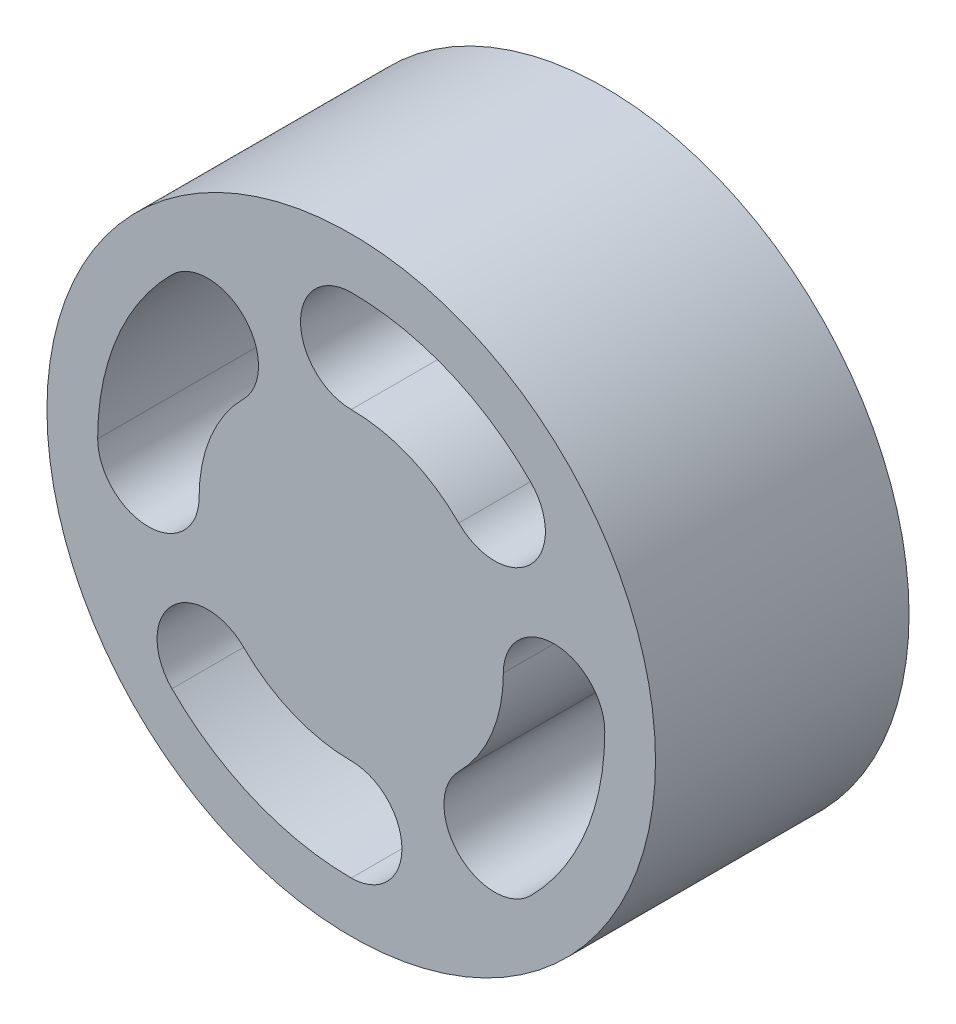
ISO-10303-21;
HEADER;
FILE_DESCRIPTION(('STEP AP214'),'2;1');
FILE_NAME('part.step','',(''),(''),'','','');
FILE_SCHEMA(('AUTOMOTIVE_DESIGN { 1 0 10303 214 1 1 1 1 }'));
ENDSEC;
DATA;
#1=APPLICATION_CONTEXT('core data for automotive mechanical design processes');
#2=APPLICATION_PROTOCOL_DEFINITION('international standard','automotive_design',2000,#1);
#3=PRODUCT_CONTEXT('',#1,'mechanical');
#4=PRODUCT('Part','Part','',(#3));
#5=PRODUCT_RELATED_PRODUCT_CATEGORY('part','',(#4));
#6=PRODUCT_DEFINITION_FORMATION('','',#4);
#7=PRODUCT_DEFINITION_CONTEXT('part definition',#1,'design');
#8=PRODUCT_DEFINITION('design','',#6,#7);
#9=PRODUCT_DEFINITION_SHAPE('','',#8);
#10=(LENGTH_UNIT() NAMED_UNIT(*) SI_UNIT(.MILLI.,.METRE.));
#11=(NAMED_UNIT(*) PLANE_ANGLE_UNIT() SI_UNIT($,.RADIAN.));
#12=(NAMED_UNIT(*) SI_UNIT($,.STERADIAN.) SOLID_ANGLE_UNIT());
#13=UNCERTAINTY_MEASURE_WITH_UNIT(LENGTH_MEASURE(1.E-05),#10,'distance_accuracy_value','');
#14=(GEOMETRIC_REPRESENTATION_CONTEXT(3) GLOBAL_UNCERTAINTY_ASSIGNED_CONTEXT((#13)) GLOBAL_UNIT_ASSIGNED_CONTEXT((#10,
#11,#12)) REPRESENTATION_CONTEXT('',''));
#15=CARTESIAN_POINT('',(0.,0.,0.));
#16=DIRECTION('',(0.,0.,1.));
#17=DIRECTION('',(1.,0.,0.));
#18=AXIS2_PLACEMENT_3D('',#15,#16,#17);
#19=CARTESIAN_POINT('',(0.,0.,0.));
#20=DIRECTION('',(0.,0.,1.));
#21=DIRECTION('',(1.,0.,0.));
#22=AXIS2_PLACEMENT_3D('',#19,#20,#21);
#23=PLANE('',#22);
#24=CARTESIAN_POINT('',(-14.1421356237309,-14.142135623731,0.));
#25=DIRECTION('',(0.,0.,-1.));
#26=DIRECTION('',(-1.,0.,0.));
#27=AXIS2_PLACEMENT_3D('',#24,#25,#26);
#28=CIRCLE('',#27,5.);
#29=CARTESIAN_POINT('',(-17.6776695296636,-17.6776695296638,0.));
#30=VERTEX_POINT('',#29);
#31=CARTESIAN_POINT('',(-10.6066017177982,-10.6066017177983,0.));
#32=VERTEX_POINT('',#31);
#33=EDGE_CURVE('E241',#30,#32,#28,.T.);
#34=ORIENTED_EDGE('',*,*,#33,.F.);
#35=CARTESIAN_POINT('',(0.,0.,0.));
#36=DIRECTION('',(0.,0.,-1.));
#37=DIRECTION('',(-1.,0.,0.));
#38=AXIS2_PLACEMENT_3D('',#35,#36,#37);
#39=CIRCLE('',#38,25.);
#40=CARTESIAN_POINT('',(1.75875109549139E-13,-25.,0.));
#41=VERTEX_POINT('',#40);
#42=EDGE_CURVE('E61',#41,#30,#39,.T.);
#43=ORIENTED_EDGE('',*,*,#42,.F.);
#44=CARTESIAN_POINT('',(1.40526615291714E-13,-20.,0.));
#45=DIRECTION('',(0.,0.,-1.));
#46=DIRECTION('',(-1.,0.,0.));
#47=AXIS2_PLACEMENT_3D('',#44,#45,#46);
#48=CIRCLE('',#47,5.);
#49=CARTESIAN_POINT('',(1.05178121034288E-13,-15.,0.));
#50=VERTEX_POINT('',#49);
#51=EDGE_CURVE('E249',#50,#41,#48,.T.);
#52=ORIENTED_EDGE('',*,*,#51,.F.);
#53=CARTESIAN_POINT('',(0.,0.,0.));
#54=DIRECTION('',(0.,0.,-1.));
#55=DIRECTION('',(-1.,0.,0.));
#56=AXIS2_PLACEMENT_3D('',#53,#54,#55);
#57=CIRCLE('',#56,15.);
#58=EDGE_CURVE('E245',#50,#32,#57,.T.);
#59=ORIENTED_EDGE('',*,*,#58,.T.);
#60=EDGE_LOOP('',(#34,#43,#52,#59));
#61=FACE_BOUND('',#60,.T.);
#62=CARTESIAN_POINT('',(0.,0.,0.));
#63=DIRECTION('',(0.,0.,-1.));
#64=DIRECTION('',(-1.,0.,0.));
#65=AXIS2_PLACEMENT_3D('',#62,#63,#64);
#66=CIRCLE('',#65,15.);
#67=CARTESIAN_POINT('',(-15.,0.,0.));
#68=VERTEX_POINT('',#67);
#69=CARTESIAN_POINT('',(-10.6066017177982,10.6066017177982,0.));
#70=VERTEX_POINT('',#69);
#71=EDGE_CURVE('E283',#68,#70,#66,.T.);
#72=ORIENTED_EDGE('',*,*,#71,.T.);
#73=CARTESIAN_POINT('',(-14.142135623731,14.1421356237309,0.));
#74=DIRECTION('',(0.,0.,-1.));
#75=DIRECTION('',(-1.,0.,0.));
#76=AXIS2_PLACEMENT_3D('',#73,#74,#75);
#77=CIRCLE('',#76,5.);
#78=CARTESIAN_POINT('',(-17.6776695296637,17.6776695296637,0.));
#79=VERTEX_POINT('',#78);
#80=EDGE_CURVE('E69',#79,#70,#77,.T.);
#81=ORIENTED_EDGE('',*,*,#80,.F.);
#82=CARTESIAN_POINT('',(0.,0.,0.));
#83=DIRECTION('',(0.,0.,-1.));
#84=DIRECTION('',(-1.,0.,0.));
#85=AXIS2_PLACEMENT_3D('',#82,#83,#84);
#86=CIRCLE('',#85,25.);
#87=CARTESIAN_POINT('',(-25.,0.,0.));
#88=VERTEX_POINT('',#87);
#89=EDGE_CURVE('E291',#88,#79,#86,.T.);
#90=ORIENTED_EDGE('',*,*,#89,.F.);
#91=CARTESIAN_POINT('',(-20.,0.,0.));
#92=DIRECTION('',(0.,0.,-1.));
#93=DIRECTION('',(-1.,0.,0.));
#94=AXIS2_PLACEMENT_3D('',#91,#92,#93);
#95=CIRCLE('',#94,5.);
#96=EDGE_CURVE('E287',#68,#88,#95,.T.);
#97=ORIENTED_EDGE('',*,*,#96,.F.);
#98=EDGE_LOOP('',(#72,#81,#90,#97));
#99=FACE_BOUND('',#98,.T.);
#100=CARTESIAN_POINT('',(14.1421356237308,14.1421356237311,0.));
#101=DIRECTION('',(0.,0.,-1.));
#102=DIRECTION('',(-1.,0.,0.));
#103=AXIS2_PLACEMENT_3D('',#100,#101,#102);
#104=CIRCLE('',#103,5.);
#105=CARTESIAN_POINT('',(17.6776695296635,17.6776695296639,0.));
#106=VERTEX_POINT('',#105);
#107=CARTESIAN_POINT('',(10.6066017177981,10.6066017177983,0.));
#108=VERTEX_POINT('',#107);
#109=EDGE_CURVE('E204',#106,#108,#104,.T.);
#110=ORIENTED_EDGE('',*,*,#109,.F.);
#111=CARTESIAN_POINT('',(0.,0.,0.));
#112=DIRECTION('',(0.,0.,-1.));
#113=DIRECTION('',(-1.,0.,0.));
#114=AXIS2_PLACEMENT_3D('',#111,#112,#113);
#115=CIRCLE('',#114,25.);
#116=CARTESIAN_POINT('',(0.,25.,0.));
#117=VERTEX_POINT('',#116);
#118=EDGE_CURVE('E192',#117,#106,#115,.T.);
#119=ORIENTED_EDGE('',*,*,#118,.F.);
#120=CARTESIAN_POINT('',(0.,20.,0.));
#121=DIRECTION('',(0.,0.,-1.));
#122=DIRECTION('',(-1.,0.,0.));
#123=AXIS2_PLACEMENT_3D('',#120,#121,#122);
#124=CIRCLE('',#123,5.);
#125=CARTESIAN_POINT('',(0.,15.,0.));
#126=VERTEX_POINT('',#125);
#127=EDGE_CURVE('E194',#126,#117,#124,.T.);
#128=ORIENTED_EDGE('',*,*,#127,.F.);
#129=CARTESIAN_POINT('',(0.,0.,0.));
#130=DIRECTION('',(0.,0.,-1.));
#131=DIRECTION('',(-1.,0.,0.));
#132=AXIS2_PLACEMENT_3D('',#129,#130,#131);
#133=CIRCLE('',#132,15.);
#134=EDGE_CURVE('E212',#126,#108,#133,.T.);
#135=ORIENTED_EDGE('',*,*,#134,.T.);
#136=EDGE_LOOP('',(#110,#119,#128,#135));
#137=FACE_BOUND('',#136,.T.);
#138=CARTESIAN_POINT('',(0.,0.,0.));
#139=DIRECTION('',(0.,0.,-1.));
#140=DIRECTION('',(-1.,0.,0.));
#141=AXIS2_PLACEMENT_3D('',#138,#139,#140);
#142=CIRCLE('',#141,15.);
#143=CARTESIAN_POINT('',(15.,1.60260846548149E-13,0.));
#144=VERTEX_POINT('',#143);
#145=CARTESIAN_POINT('',(10.6066017177983,-10.6066017177981,0.));
#146=VERTEX_POINT('',#145);
#147=EDGE_CURVE('E324',#144,#146,#142,.T.);
#148=ORIENTED_EDGE('',*,*,#147,.T.);
#149=CARTESIAN_POINT('',(14.1421356237311,-14.1421356237308,0.));
#150=DIRECTION('',(0.,0.,-1.));
#151=DIRECTION('',(-1.,0.,0.));
#152=AXIS2_PLACEMENT_3D('',#149,#150,#151);
#153=CIRCLE('',#152,5.);
#154=CARTESIAN_POINT('',(17.6776695296638,-17.6776695296635,0.));
#155=VERTEX_POINT('',#154);
#156=EDGE_CURVE('E321',#155,#146,#153,.T.);
#157=ORIENTED_EDGE('',*,*,#156,.F.);
#158=CARTESIAN_POINT('',(0.,0.,0.));
#159=DIRECTION('',(0.,0.,-1.));
#160=DIRECTION('',(-1.,0.,0.));
#161=AXIS2_PLACEMENT_3D('',#158,#159,#160);
#162=CIRCLE('',#161,25.);
#163=CARTESIAN_POINT('',(25.,2.67390531492911E-13,0.));
#164=VERTEX_POINT('',#163);
#165=EDGE_CURVE('E332',#164,#155,#162,.T.);
#166=ORIENTED_EDGE('',*,*,#165,.F.);
#167=CARTESIAN_POINT('',(20.,2.1382568902053E-13,0.));
#168=DIRECTION('',(0.,0.,-1.));
#169=DIRECTION('',(-1.,0.,0.));
#170=AXIS2_PLACEMENT_3D('',#167,#168,#169);
#171=CIRCLE('',#170,5.);
#172=EDGE_CURVE('E328',#144,#164,#171,.T.);
#173=ORIENTED_EDGE('',*,*,#172,.F.);
#174=EDGE_LOOP('',(#148,#157,#166,#173));
#175=FACE_BOUND('',#174,.T.);
#176=CARTESIAN_POINT('',(0.,0.,0.));
#177=DIRECTION('',(0.,0.,1.));
#178=DIRECTION('',(1.,0.,0.));
#179=AXIS2_PLACEMENT_3D('',#176,#177,#178);
#180=CIRCLE('',#179,3.);
#181=CARTESIAN_POINT('',(3.,0.,0.));
#182=VERTEX_POINT('',#181);
#183=EDGE_CURVE('E366',#182,#182,#180,.T.);
#184=ORIENTED_EDGE('',*,*,#183,.T.);
#185=EDGE_LOOP('',(#184));
#186=FACE_BOUND('',#185,.T.);
#187=CARTESIAN_POINT('',(0.,0.,0.));
#188=DIRECTION('',(0.,0.,1.));
#189=DIRECTION('',(1.,0.,0.));
#190=AXIS2_PLACEMENT_3D('',#187,#188,#189);
#191=CIRCLE('',#190,30.);
#192=CARTESIAN_POINT('',(30.,0.,0.));
#193=VERTEX_POINT('',#192);
#194=EDGE_CURVE('E49',#193,#193,#191,.T.);
#195=ORIENTED_EDGE('',*,*,#194,.F.);
#196=EDGE_LOOP('',(#195));
#197=FACE_BOUND('',#196,.T.);
#198=ADVANCED_FACE('F45',(#61,#99,#137,#175,#186,#197),#23,.F.);
#199=CARTESIAN_POINT('',(0.,0.,25.));
#200=DIRECTION('',(0.,0.,-1.));
#201=DIRECTION('',(-1.,0.,0.));
#202=AXIS2_PLACEMENT_3D('',#199,#200,#201);
#203=CYLINDRICAL_SURFACE('',#202,30.);
#204=CARTESIAN_POINT('',(0.,0.,25.));
#205=DIRECTION('',(0.,0.,1.));
#206=DIRECTION('',(1.,0.,0.));
#207=AXIS2_PLACEMENT_3D('',#204,#205,#206);
#208=CIRCLE('',#207,30.);
#209=CARTESIAN_POINT('',(30.,0.,25.));
#210=VERTEX_POINT('',#209);
#211=EDGE_CURVE('E11',#210,#210,#208,.T.);
#212=ORIENTED_EDGE('',*,*,#211,.F.);
#213=EDGE_LOOP('',(#212));
#214=FACE_BOUND('',#213,.T.);
#215=ORIENTED_EDGE('',*,*,#194,.T.);
#216=EDGE_LOOP('',(#215));
#217=FACE_BOUND('',#216,.T.);
#218=ADVANCED_FACE('F47',(#214,#217),#203,.T.);
#219=CARTESIAN_POINT('',(0.,0.,25.));
#220=DIRECTION('',(0.,0.,1.));
#221=DIRECTION('',(1.,0.,0.));
#222=AXIS2_PLACEMENT_3D('',#219,#220,#221);
#223=PLANE('',#222);
#224=CARTESIAN_POINT('',(0.,0.,25.));
#225=DIRECTION('',(0.,0.,1.));
#226=DIRECTION('',(1.,0.,0.));
#227=AXIS2_PLACEMENT_3D('',#224,#225,#226);
#228=CIRCLE('',#227,25.);
#229=CARTESIAN_POINT('',(1.75875109549139E-13,-25.,25.));
#230=VERTEX_POINT('',#229);
#231=CARTESIAN_POINT('',(-17.6776695296636,-17.6776695296638,25.));
#232=VERTEX_POINT('',#231);
#233=EDGE_CURVE('E235',#230,#232,#228,.F.);
#234=ORIENTED_EDGE('',*,*,#233,.T.);
#235=CARTESIAN_POINT('',(-14.1421356237309,-14.142135623731,25.));
#236=DIRECTION('',(0.,0.,1.));
#237=DIRECTION('',(1.,0.,0.));
#238=AXIS2_PLACEMENT_3D('',#235,#236,#237);
#239=CIRCLE('',#238,5.);
#240=CARTESIAN_POINT('',(-10.6066017177982,-10.6066017177983,25.));
#241=VERTEX_POINT('',#240);
#242=EDGE_CURVE('E257',#232,#241,#239,.F.);
#243=ORIENTED_EDGE('',*,*,#242,.T.);
#244=CARTESIAN_POINT('',(0.,0.,25.));
#245=DIRECTION('',(0.,0.,1.));
#246=DIRECTION('',(1.,0.,0.));
#247=AXIS2_PLACEMENT_3D('',#244,#245,#246);
#248=CIRCLE('',#247,15.);
#249=CARTESIAN_POINT('',(1.05178121034288E-13,-15.,25.));
#250=VERTEX_POINT('',#249);
#251=EDGE_CURVE('E226',#250,#241,#248,.F.);
#252=ORIENTED_EDGE('',*,*,#251,.F.);
#253=CARTESIAN_POINT('',(1.40526615291714E-13,-20.,25.));
#254=DIRECTION('',(0.,0.,1.));
#255=DIRECTION('',(1.,0.,0.));
#256=AXIS2_PLACEMENT_3D('',#253,#254,#255);
#257=CIRCLE('',#256,5.);
#258=EDGE_CURVE('E230',#250,#230,#257,.F.);
#259=ORIENTED_EDGE('',*,*,#258,.T.);
#260=EDGE_LOOP('',(#234,#243,#252,#259));
#261=FACE_BOUND('',#260,.T.);
#262=CARTESIAN_POINT('',(-14.142135623731,14.1421356237309,25.));
#263=DIRECTION('',(0.,0.,1.));
#264=DIRECTION('',(1.,0.,0.));
#265=AXIS2_PLACEMENT_3D('',#262,#263,#264);
#266=CIRCLE('',#265,5.);
#267=CARTESIAN_POINT('',(-17.6776695296637,17.6776695296637,25.));
#268=VERTEX_POINT('',#267);
#269=CARTESIAN_POINT('',(-10.6066017177982,10.6066017177982,25.));
#270=VERTEX_POINT('',#269);
#271=EDGE_CURVE('E277',#268,#270,#266,.F.);
#272=ORIENTED_EDGE('',*,*,#271,.T.);
#273=CARTESIAN_POINT('',(0.,0.,25.));
#274=DIRECTION('',(0.,0.,1.));
#275=DIRECTION('',(1.,0.,0.));
#276=AXIS2_PLACEMENT_3D('',#273,#274,#275);
#277=CIRCLE('',#276,15.);
#278=CARTESIAN_POINT('',(-15.,0.,25.));
#279=VERTEX_POINT('',#278);
#280=EDGE_CURVE('E231',#279,#270,#277,.F.);
#281=ORIENTED_EDGE('',*,*,#280,.F.);
#282=CARTESIAN_POINT('',(-20.,0.,25.));
#283=DIRECTION('',(0.,0.,1.));
#284=DIRECTION('',(1.,0.,0.));
#285=AXIS2_PLACEMENT_3D('',#282,#283,#284);
#286=CIRCLE('',#285,5.);
#287=CARTESIAN_POINT('',(-25.,0.,25.));
#288=VERTEX_POINT('',#287);
#289=EDGE_CURVE('E184',#279,#288,#286,.F.);
#290=ORIENTED_EDGE('',*,*,#289,.T.);
#291=CARTESIAN_POINT('',(0.,0.,25.));
#292=DIRECTION('',(0.,0.,1.));
#293=DIRECTION('',(1.,0.,0.));
#294=AXIS2_PLACEMENT_3D('',#291,#292,#293);
#295=CIRCLE('',#294,25.);
#296=EDGE_CURVE('E273',#288,#268,#295,.F.);
#297=ORIENTED_EDGE('',*,*,#296,.T.);
#298=EDGE_LOOP('',(#272,#281,#290,#297));
#299=FACE_BOUND('',#298,.T.);
#300=CARTESIAN_POINT('',(0.,0.,25.));
#301=DIRECTION('',(0.,0.,1.));
#302=DIRECTION('',(1.,0.,0.));
#303=AXIS2_PLACEMENT_3D('',#300,#301,#302);
#304=CIRCLE('',#303,25.);
#305=CARTESIAN_POINT('',(0.,25.,25.));
#306=VERTEX_POINT('',#305);
#307=CARTESIAN_POINT('',(17.6776695296635,17.6776695296639,25.));
#308=VERTEX_POINT('',#307);
#309=EDGE_CURVE('E189',#306,#308,#304,.F.);
#310=ORIENTED_EDGE('',*,*,#309,.T.);
#311=CARTESIAN_POINT('',(14.1421356237308,14.1421356237311,25.));
#312=DIRECTION('',(0.,0.,1.));
#313=DIRECTION('',(1.,0.,0.));
#314=AXIS2_PLACEMENT_3D('',#311,#312,#313);
#315=CIRCLE('',#314,5.);
#316=CARTESIAN_POINT('',(10.6066017177981,10.6066017177983,25.));
#317=VERTEX_POINT('',#316);
#318=EDGE_CURVE('E172',#308,#317,#315,.F.);
#319=ORIENTED_EDGE('',*,*,#318,.T.);
#320=CARTESIAN_POINT('',(0.,0.,25.));
#321=DIRECTION('',(0.,0.,1.));
#322=DIRECTION('',(1.,0.,0.));
#323=AXIS2_PLACEMENT_3D('',#320,#321,#322);
#324=CIRCLE('',#323,15.);
#325=CARTESIAN_POINT('',(0.,15.,25.));
#326=VERTEX_POINT('',#325);
#327=EDGE_CURVE('E206',#326,#317,#324,.F.);
#328=ORIENTED_EDGE('',*,*,#327,.F.);
#329=CARTESIAN_POINT('',(0.,20.,25.));
#330=DIRECTION('',(0.,0.,1.));
#331=DIRECTION('',(1.,0.,0.));
#332=AXIS2_PLACEMENT_3D('',#329,#330,#331);
#333=CIRCLE('',#332,5.);
#334=EDGE_CURVE('E199',#326,#306,#333,.F.);
#335=ORIENTED_EDGE('',*,*,#334,.T.);
#336=EDGE_LOOP('',(#310,#319,#328,#335));
#337=FACE_BOUND('',#336,.T.);
#338=CARTESIAN_POINT('',(14.1421356237311,-14.1421356237308,25.));
#339=DIRECTION('',(0.,0.,1.));
#340=DIRECTION('',(1.,0.,0.));
#341=AXIS2_PLACEMENT_3D('',#338,#339,#340);
#342=CIRCLE('',#341,5.);
#343=CARTESIAN_POINT('',(17.6776695296638,-17.6776695296635,25.));
#344=VERTEX_POINT('',#343);
#345=CARTESIAN_POINT('',(10.6066017177983,-10.6066017177981,25.));
#346=VERTEX_POINT('',#345);
#347=EDGE_CURVE('E317',#344,#346,#342,.F.);
#348=ORIENTED_EDGE('',*,*,#347,.T.);
#349=CARTESIAN_POINT('',(0.,0.,25.));
#350=DIRECTION('',(0.,0.,1.));
#351=DIRECTION('',(1.,0.,0.));
#352=AXIS2_PLACEMENT_3D('',#349,#350,#351);
#353=CIRCLE('',#352,15.);
#354=CARTESIAN_POINT('',(15.,0.,25.));
#355=VERTEX_POINT('',#354);
#356=EDGE_CURVE('E340',#355,#346,#353,.F.);
#357=ORIENTED_EDGE('',*,*,#356,.F.);
#358=CARTESIAN_POINT('',(20.,2.1382568902053E-13,25.));
#359=DIRECTION('',(0.,0.,1.));
#360=DIRECTION('',(1.,0.,0.));
#361=AXIS2_PLACEMENT_3D('',#358,#359,#360);
#362=CIRCLE('',#361,5.);
#363=CARTESIAN_POINT('',(25.,2.67390531492911E-13,25.));
#364=VERTEX_POINT('',#363);
#365=EDGE_CURVE('E269',#355,#364,#362,.F.);
#366=ORIENTED_EDGE('',*,*,#365,.T.);
#367=CARTESIAN_POINT('',(0.,0.,25.));
#368=DIRECTION('',(0.,0.,1.));
#369=DIRECTION('',(1.,0.,0.));
#370=AXIS2_PLACEMENT_3D('',#367,#368,#369);
#371=CIRCLE('',#370,25.);
#372=EDGE_CURVE('E313',#364,#344,#371,.F.);
#373=ORIENTED_EDGE('',*,*,#372,.T.);
#374=EDGE_LOOP('',(#348,#357,#366,#373));
#375=FACE_BOUND('',#374,.T.);
#376=ORIENTED_EDGE('',*,*,#211,.T.);
#377=EDGE_LOOP('',(#376));
#378=FACE_BOUND('',#377,.T.);
#379=ADVANCED_FACE('F197',(#261,#299,#337,#375,#378),#223,.T.);
#380=CARTESIAN_POINT('',(0.,1.4,-10.));
#381=DIRECTION('',(0.,-1.,0.));
#382=DIRECTION('',(0.,0.,-1.));
#383=AXIS2_PLACEMENT_3D('',#380,#381,#382);
#384=PLANE('',#383);
#385=CARTESIAN_POINT('',(0.,1.4,-7.));
#386=DIRECTION('',(0.,-1.,0.));
#387=DIRECTION('',(0.,0.,-1.));
#388=AXIS2_PLACEMENT_3D('',#385,#386,#387);
#389=CIRCLE('',#388,1.);
#390=CARTESIAN_POINT('',(0.,1.4,-8.));
#391=VERTEX_POINT('',#390);
#392=EDGE_CURVE('E353',#391,#391,#389,.F.);
#393=ORIENTED_EDGE('',*,*,#392,.T.);
#394=EDGE_LOOP('',(#393));
#395=FACE_BOUND('',#394,.T.);
#396=DIRECTION('',(1.,0.,0.));
#397=VECTOR('',#396,1.);
#398=CARTESIAN_POINT('',(0.,1.4,0.));
#399=LINE('',#398,#397);
#400=CARTESIAN_POINT('',(-1.42828568570857,1.4,0.));
#401=VERTEX_POINT('',#400);
#402=CARTESIAN_POINT('',(1.42828568570857,1.4,0.));
#403=VERTEX_POINT('',#402);
#404=EDGE_CURVE('E439',#401,#403,#399,.T.);
#405=ORIENTED_EDGE('',*,*,#404,.F.);
#406=DIRECTION('',(0.,0.,1.));
#407=VECTOR('',#406,1.);
#408=CARTESIAN_POINT('',(-1.42828568570857,1.4,-10.));
#409=LINE('',#408,#407);
#410=CARTESIAN_POINT('',(-1.42828568570857,1.4,-10.));
#411=VERTEX_POINT('',#410);
#412=EDGE_CURVE('E423',#411,#401,#409,.T.);
#413=ORIENTED_EDGE('',*,*,#412,.F.);
#414=DIRECTION('',(1.,0.,0.));
#415=VECTOR('',#414,1.);
#416=CARTESIAN_POINT('',(0.,1.4,-10.));
#417=LINE('',#416,#415);
#418=CARTESIAN_POINT('',(1.42828568570857,1.4,-10.));
#419=VERTEX_POINT('',#418);
#420=EDGE_CURVE('E445',#411,#419,#417,.T.);
#421=ORIENTED_EDGE('',*,*,#420,.T.);
#422=DIRECTION('',(0.,0.,1.));
#423=VECTOR('',#422,1.);
#424=CARTESIAN_POINT('',(1.42828568570857,1.4,-10.));
#425=LINE('',#424,#423);
#426=EDGE_CURVE('E426',#419,#403,#425,.T.);
#427=ORIENTED_EDGE('',*,*,#426,.T.);
#428=EDGE_LOOP('',(#405,#413,#421,#427));
#429=FACE_BOUND('',#428,.T.);
#430=ADVANCED_FACE('F384',(#395,#429),#384,.T.);
#431=CARTESIAN_POINT('',(0.,0.,-10.));
#432=DIRECTION('',(0.,0.,1.));
#433=DIRECTION('',(1.,0.,0.));
#434=AXIS2_PLACEMENT_3D('',#431,#432,#433);
#435=CYLINDRICAL_SURFACE('',#434,3.);
#436=CARTESIAN_POINT('',(0.,3.,-6.));
#437=CARTESIAN_POINT('',(-0.0545633628867233,3.00000015300943,-5.99999974626836));
#438=CARTESIAN_POINT('',(-0.10912519453855,2.99849769507545,-6.00448026612722));
#439=CARTESIAN_POINT('',(-0.216641760872972,2.99265210203281,-6.02222910881722));
#440=CARTESIAN_POINT('',(-0.269596328118818,2.98830867202153,-6.03549834394892));
#441=CARTESIAN_POINT('',(-0.372332789501776,2.97725307906443,-6.07031924338405));
#442=CARTESIAN_POINT('',(-0.422119825886034,2.97054487730853,-6.09185706245927));
#443=CARTESIAN_POINT('',(-0.517374936805325,2.95544445717342,-6.14254117283835));
#444=CARTESIAN_POINT('',(-0.562842156958706,2.94705190667778,-6.1716889650026));
#445=CARTESIAN_POINT('',(-0.649741675022266,2.92914094443005,-6.23782580485875));
#446=CARTESIAN_POINT('',(-0.691003700298309,2.91959556463785,-6.27503123426049));
#447=CARTESIAN_POINT('',(-0.766832692702084,2.90060314783122,-6.35576715470657));
#448=CARTESIAN_POINT('',(-0.801398185489462,2.89115613290549,-6.39929903492851));
#449=CARTESIAN_POINT('',(-0.863824942227859,2.87313332477274,-6.49298511519646));
#450=CARTESIAN_POINT('',(-0.891464858221032,2.86459039275688,-6.54329373973212));
#451=CARTESIAN_POINT('',(-0.937818873877721,2.84975305418601,-6.64817609445855));
#452=CARTESIAN_POINT('',(-0.956535697386765,2.84345796160746,-6.70274851716274));
#453=CARTESIAN_POINT('',(-0.983873461509163,2.83411303269377,-6.81267322149671));
#454=CARTESIAN_POINT('',(-0.992813448271769,2.83096095769611,-6.86793720848906));
#455=CARTESIAN_POINT('',(-1.00134112333448,2.82795656629508,-6.97926375415588));
#456=CARTESIAN_POINT('',(-1.00093170160472,2.8281032302273,-7.03532606070919));
#457=CARTESIAN_POINT('',(-0.991019903703419,2.8315901500818,-7.14393663044402));
#458=CARTESIAN_POINT('',(-0.981933913166995,2.83478415867533,-7.19652840291902));
#459=CARTESIAN_POINT('',(-0.955606162849417,2.84376657724551,-7.29939341960683));
#460=CARTESIAN_POINT('',(-0.938363426591871,2.84955529784108,-7.34966638543507));
#461=CARTESIAN_POINT('',(-0.895939058060211,2.86317911131249,-7.44741274959148));
#462=CARTESIAN_POINT('',(-0.870634048707263,2.87104565793117,-7.49482802546953));
#463=CARTESIAN_POINT('',(-0.812889106303139,2.88792558575726,-7.58487090827973));
#464=CARTESIAN_POINT('',(-0.780447112364006,2.89693929790464,-7.62749712693338));
#465=CARTESIAN_POINT('',(-0.707349332682238,2.91567329167741,-7.70909159816077));
#466=CARTESIAN_POINT('',(-0.666353150076312,2.92540589354843,-7.74775269450907));
#467=CARTESIAN_POINT('',(-0.578339569970065,2.94406938387037,-7.8177312666634));
#468=CARTESIAN_POINT('',(-0.531321595660815,2.95300019538067,-7.8490480381645));
#469=CARTESIAN_POINT('',(-0.431947613046268,2.96917107937794,-7.90369630023507));
#470=CARTESIAN_POINT('',(-0.379543276416337,2.97639350008039,-7.92694549134073));
#471=CARTESIAN_POINT('',(-0.271269083364507,2.98820567144435,-7.96420317395571));
#472=CARTESIAN_POINT('',(-0.215400438154954,2.99279633654879,-7.97821487542344));
#473=CARTESIAN_POINT('',(-0.104383829529304,2.99867627071441,-7.99605566602236));
#474=CARTESIAN_POINT('',(-0.0493095998648452,3.00010001833731,-8.00029980917275));
#475=CARTESIAN_POINT('',(0.0607750699602362,2.99988902694825,-7.99966732640153));
#476=CARTESIAN_POINT('',(0.115785519319647,2.99825480419352,-7.99479224002013));
#477=CARTESIAN_POINT('',(0.222519866304259,2.99220024717114,-7.97638809226403));
#478=CARTESIAN_POINT('',(0.274292806834856,2.98786198711228,-7.96311379395048));
#479=CARTESIAN_POINT('',(0.374855958579561,2.97691846830034,-7.9286065555333));
#480=CARTESIAN_POINT('',(0.423645788508559,2.97031292046541,-7.90737260053232));
#481=CARTESIAN_POINT('',(0.518288296393321,2.95528931287427,-7.8569295681591));
#482=CARTESIAN_POINT('',(0.56402995921733,2.94682814756305,-7.8275254067164));
#483=CARTESIAN_POINT('',(0.650064830135404,2.92905253915743,-7.76180584998695));
#484=CARTESIAN_POINT('',(0.690356367794894,2.91973783591888,-7.72548834396984));
#485=CARTESIAN_POINT('',(0.766252507807013,2.90076847982472,-7.64502124899174));
#486=CARTESIAN_POINT('',(0.801560969248492,2.89111761095155,-7.60059077306675));
#487=CARTESIAN_POINT('',(0.864257522320854,2.87299973286981,-7.5062284321955));
#488=CARTESIAN_POINT('',(0.891645547920843,2.8645327335312,-7.4562965213898));
#489=CARTESIAN_POINT('',(0.93759693042336,2.84982391820308,-7.35232698469341));
#490=CARTESIAN_POINT('',(0.956178132197766,2.84357760900632,-7.29829792075722));
#491=CARTESIAN_POINT('',(0.983894666792163,2.83410832399133,-7.18762134987585));
#492=CARTESIAN_POINT('',(0.993034254961244,2.83088398622698,-7.13097503456694));
#493=CARTESIAN_POINT('',(1.00127628247038,2.82797858875071,-7.01980290398679));
#494=CARTESIAN_POINT('',(1.00087025731093,2.82812400344299,-6.96531765974826));
#495=CARTESIAN_POINT('',(0.991242293454878,2.8315126992356,-6.85723492510026));
#496=CARTESIAN_POINT('',(0.982020879458887,2.83475579595884,-6.80363738204709));
#497=CARTESIAN_POINT('',(0.95537181312698,2.84384524278943,-6.69986433698733));
#498=CARTESIAN_POINT('',(0.938103346014879,2.84964098015514,-6.64964317499277));
#499=CARTESIAN_POINT('',(0.895979365760382,2.86316398825434,-6.55277259306447));
#500=CARTESIAN_POINT('',(0.871122168553979,2.87089168765297,-6.50612396881274));
#501=CARTESIAN_POINT('',(0.813260692583249,2.8878282922406,-6.41551633007631));
#502=CARTESIAN_POINT('',(0.779948242764532,2.89708711641604,-6.37176349810141));
#503=CARTESIAN_POINT('',(0.706642883135697,2.91583356283786,-6.29031018661601));
#504=CARTESIAN_POINT('',(0.666648084451495,2.92532124912518,-6.25261142431198));
#505=CARTESIAN_POINT('',(0.579241556920675,2.94390030525393,-6.18285558771076));
#506=CARTESIAN_POINT('',(0.531601513499726,2.95296181801216,-6.15107565224898));
#507=CARTESIAN_POINT('',(0.431357357406629,2.96925991172652,-6.09600957114937));
#508=CARTESIAN_POINT('',(0.37875451813235,2.9764969590794,-6.07272125407796));
#509=CARTESIAN_POINT('',(0.272493647200975,2.98805515068532,-6.03627836751132));
#510=CARTESIAN_POINT('',(0.218987757676409,2.9924921242252,-6.02271753373662));
#511=CARTESIAN_POINT('',(0.110320416010248,2.99846407064225,-6.00457971932287));
#512=CARTESIAN_POINT('',(0.0551594255687466,2.99999984531906,-6.00000025650346));
#513=CARTESIAN_POINT('',(0.,3.,-6.));
#514=B_SPLINE_CURVE_WITH_KNOTS('',3,(#436,#437,#438,#439,#440,#441,#442,#443,#444,#445,#446,
#447,#448,#449,#450,#451,#452,#453,#454,#455,#456,#457,#458,#459,#460,#461,#462,#463,#464,#465,
#466,#467,#468,#469,#470,#471,#472,#473,#474,#475,#476,#477,#478,#479,#480,#481,#482,#483,#484,
#485,#486,#487,#488,#489,#490,#491,#492,#493,#494,#495,#496,#497,#498,#499,#500,#501,#502,#503,
#504,#505,#506,#507,#508,#509,#510,#511,#512,#513),.UNSPECIFIED.,.T.,.F.,(4,2,2,2,2,2,2,2,2,2,2,
2,2,2,2,2,2,2,2,2,2,2,2,2,2,2,2,2,2,2,2,2,2,2,2,2,2,2,4),(0.,0.163487106026011,
0.326991185267521,0.490222672870274,0.6534863777991,0.821846842827559,0.990244332875302,
1.1634838482347,1.33667044692833,1.5040192574184,1.67131633987485,1.8309682655128,
1.99063930855482,2.15288171155131,2.31517102558207,2.48593305811367,2.65671145966618,
2.82918405650358,3.00159668877208,3.1665358317517,3.33144713164177,3.49158157978213,
3.65173645284104,3.81610399843736,3.98052180821891,4.15241022880752,4.32430008234997,
4.49584013824416,4.66730284700846,4.82995666056619,4.99260079341185,5.15215587070227,
5.31174638165787,5.47830066681615,5.64490211113589,5.8179966082491,5.99104681142266,
6.15636558363624,6.3216386602795),.UNSPECIFIED.);
#515=CARTESIAN_POINT('',(0.,3.,-6.));
#516=VERTEX_POINT('',#515);
#517=EDGE_CURVE('E357',#516,#516,#514,.T.);
#518=ORIENTED_EDGE('',*,*,#517,.T.);
#519=EDGE_LOOP('',(#518));
#520=FACE_BOUND('',#519,.T.);
#521=CARTESIAN_POINT('',(0.,0.,-10.));
#522=DIRECTION('',(0.,0.,1.));
#523=DIRECTION('',(1.,0.,0.));
#524=AXIS2_PLACEMENT_3D('',#521,#522,#523);
#525=CIRCLE('',#524,3.);
#526=CARTESIAN_POINT('',(3.,0.,-10.));
#527=VERTEX_POINT('',#526);
#528=EDGE_CURVE('E367',#527,#527,#525,.T.);
#529=ORIENTED_EDGE('',*,*,#528,.T.);
#530=EDGE_LOOP('',(#529));
#531=FACE_BOUND('',#530,.T.);
#532=ORIENTED_EDGE('',*,*,#183,.F.);
#533=EDGE_LOOP('',(#532));
#534=FACE_BOUND('',#533,.T.);
#535=ADVANCED_FACE('F382',(#520,#531,#534),#435,.T.);
#536=CARTESIAN_POINT('',(0.,0.,-10.));
#537=DIRECTION('',(0.,0.,1.));
#538=DIRECTION('',(1.,0.,0.));
#539=AXIS2_PLACEMENT_3D('',#536,#537,#538);
#540=CYLINDRICAL_SURFACE('',#539,2.);
#541=CARTESIAN_POINT('',(0.,0.,0.));
#542=DIRECTION('',(0.,0.,1.));
#543=DIRECTION('',(1.,0.,0.));
#544=AXIS2_PLACEMENT_3D('',#541,#542,#543);
#545=CIRCLE('',#544,2.);
#546=EDGE_CURVE('E436',#401,#403,#545,.T.);
#547=ORIENTED_EDGE('',*,*,#546,.T.);
#548=ORIENTED_EDGE('',*,*,#426,.F.);
#549=CARTESIAN_POINT('',(0.,0.,-10.));
#550=DIRECTION('',(0.,0.,1.));
#551=DIRECTION('',(1.,0.,0.));
#552=AXIS2_PLACEMENT_3D('',#549,#550,#551);
#553=CIRCLE('',#552,2.);
#554=EDGE_CURVE('E433',#411,#419,#553,.T.);
#555=ORIENTED_EDGE('',*,*,#554,.F.);
#556=ORIENTED_EDGE('',*,*,#412,.T.);
#557=EDGE_LOOP('',(#547,#548,#555,#556));
#558=FACE_BOUND('',#557,.T.);
#559=ADVANCED_FACE('F378',(#558),#540,.F.);
#560=CARTESIAN_POINT('',(0.,0.,-10.));
#561=DIRECTION('',(0.,0.,1.));
#562=DIRECTION('',(1.,0.,0.));
#563=AXIS2_PLACEMENT_3D('',#560,#561,#562);
#564=PLANE('',#563);
#565=ORIENTED_EDGE('',*,*,#528,.F.);
#566=EDGE_LOOP('',(#565));
#567=FACE_BOUND('',#566,.T.);
#568=ORIENTED_EDGE('',*,*,#420,.F.);
#569=ORIENTED_EDGE('',*,*,#554,.T.);
#570=EDGE_LOOP('',(#568,#569));
#571=FACE_BOUND('',#570,.T.);
#572=ADVANCED_FACE('F374',(#567,#571),#564,.F.);
#573=ORIENTED_EDGE('',*,*,#546,.F.);
#574=ORIENTED_EDGE('',*,*,#404,.T.);
#575=EDGE_LOOP('',(#573,#574));
#576=FACE_BOUND('',#575,.T.);
#577=ADVANCED_FACE('F377',(#576),#23,.F.);
#578=CARTESIAN_POINT('',(0.,-30.001,-7.));
#579=DIRECTION('',(0.,1.,0.));
#580=DIRECTION('',(0.,0.,1.));
#581=AXIS2_PLACEMENT_3D('',#578,#579,#580);
#582=CYLINDRICAL_SURFACE('',#581,1.);
#583=ORIENTED_EDGE('',*,*,#392,.F.);
#584=EDGE_LOOP('',(#583));
#585=FACE_BOUND('',#584,.T.);
#586=ORIENTED_EDGE('',*,*,#517,.F.);
#587=EDGE_LOOP('',(#586));
#588=FACE_BOUND('',#587,.T.);
#589=ADVANCED_FACE('F369',(#585,#588),#582,.F.);
#590=CARTESIAN_POINT('',(14.1421356237311,-14.1421356237308,25.001));
#591=DIRECTION('',(0.,0.,-1.));
#592=DIRECTION('',(-1.,0.,0.));
#593=AXIS2_PLACEMENT_3D('',#590,#591,#592);
#594=CYLINDRICAL_SURFACE('',#593,5.);
#595=DIRECTION('',(0.,0.,-1.));
#596=VECTOR('',#595,1.);
#597=CARTESIAN_POINT('',(17.6776695296638,-17.6776695296635,25.001));
#598=LINE('',#597,#596);
#599=EDGE_CURVE('E337',#344,#155,#598,.T.);
#600=ORIENTED_EDGE('',*,*,#599,.T.);
#601=ORIENTED_EDGE('',*,*,#156,.T.);
#602=DIRECTION('',(0.,0.,-1.));
#603=VECTOR('',#602,1.);
#604=CARTESIAN_POINT('',(10.6066017177983,-10.6066017177981,25.001));
#605=LINE('',#604,#603);
#606=EDGE_CURVE('E336',#346,#146,#605,.T.);
#607=ORIENTED_EDGE('',*,*,#606,.F.);
#608=ORIENTED_EDGE('',*,*,#347,.F.);
#609=EDGE_LOOP('',(#600,#601,#607,#608));
#610=FACE_BOUND('',#609,.T.);
#611=ADVANCED_FACE('F398',(#610),#594,.F.);
#612=CARTESIAN_POINT('',(0.,0.,25.001));
#613=DIRECTION('',(0.,0.,-1.));
#614=DIRECTION('',(-1.,0.,0.));
#615=AXIS2_PLACEMENT_3D('',#612,#613,#614);
#616=CYLINDRICAL_SURFACE('',#615,25.);
#617=DIRECTION('',(0.,0.,-1.));
#618=VECTOR('',#617,1.);
#619=CARTESIAN_POINT('',(25.,2.67390531492911E-13,25.001));
#620=LINE('',#619,#618);
#621=EDGE_CURVE('E341',#364,#164,#620,.T.);
#622=ORIENTED_EDGE('',*,*,#621,.T.);
#623=ORIENTED_EDGE('',*,*,#165,.T.);
#624=ORIENTED_EDGE('',*,*,#599,.F.);
#625=ORIENTED_EDGE('',*,*,#372,.F.);
#626=EDGE_LOOP('',(#622,#623,#624,#625));
#627=FACE_BOUND('',#626,.T.);
#628=ADVANCED_FACE('F466',(#627),#616,.F.);
#629=CARTESIAN_POINT('',(20.,2.1382568902053E-13,25.001));
#630=DIRECTION('',(0.,0.,-1.));
#631=DIRECTION('',(-1.,0.,0.));
#632=AXIS2_PLACEMENT_3D('',#629,#630,#631);
#633=CYLINDRICAL_SURFACE('',#632,5.);
#634=DIRECTION('',(0.,0.,-1.));
#635=VECTOR('',#634,1.);
#636=CARTESIAN_POINT('',(15.,1.60260846548149E-13,25.001));
#637=LINE('',#636,#635);
#638=EDGE_CURVE('E344',#355,#144,#637,.T.);
#639=ORIENTED_EDGE('',*,*,#638,.T.);
#640=ORIENTED_EDGE('',*,*,#172,.T.);
#641=ORIENTED_EDGE('',*,*,#621,.F.);
#642=ORIENTED_EDGE('',*,*,#365,.F.);
#643=EDGE_LOOP('',(#639,#640,#641,#642));
#644=FACE_BOUND('',#643,.T.);
#645=ADVANCED_FACE('F468',(#644),#633,.F.);
#646=CARTESIAN_POINT('',(0.,0.,25.001));
#647=DIRECTION('',(0.,0.,-1.));
#648=DIRECTION('',(-1.,0.,0.));
#649=AXIS2_PLACEMENT_3D('',#646,#647,#648);
#650=CYLINDRICAL_SURFACE('',#649,15.);
#651=ORIENTED_EDGE('',*,*,#356,.T.);
#652=ORIENTED_EDGE('',*,*,#606,.T.);
#653=ORIENTED_EDGE('',*,*,#147,.F.);
#654=ORIENTED_EDGE('',*,*,#638,.F.);
#655=EDGE_LOOP('',(#651,#652,#653,#654));
#656=FACE_BOUND('',#655,.T.);
#657=ADVANCED_FACE('F460',(#656),#650,.T.);
#658=CARTESIAN_POINT('',(0.,0.,25.001));
#659=DIRECTION('',(0.,0.,-1.));
#660=DIRECTION('',(-1.,0.,0.));
#661=AXIS2_PLACEMENT_3D('',#658,#659,#660);
#662=CYLINDRICAL_SURFACE('',#661,25.);
#663=DIRECTION('',(0.,0.,-1.));
#664=VECTOR('',#663,1.);
#665=CARTESIAN_POINT('',(0.,25.,25.001));
#666=LINE('',#665,#664);
#667=EDGE_CURVE('E185',#306,#117,#666,.T.);
#668=ORIENTED_EDGE('',*,*,#667,.T.);
#669=ORIENTED_EDGE('',*,*,#118,.T.);
#670=DIRECTION('',(0.,0.,-1.));
#671=VECTOR('',#670,1.);
#672=CARTESIAN_POINT('',(17.6776695296635,17.6776695296639,25.001));
#673=LINE('',#672,#671);
#674=EDGE_CURVE('E176',#308,#106,#673,.T.);
#675=ORIENTED_EDGE('',*,*,#674,.F.);
#676=ORIENTED_EDGE('',*,*,#309,.F.);
#677=EDGE_LOOP('',(#668,#669,#675,#676));
#678=FACE_BOUND('',#677,.T.);
#679=ADVANCED_FACE('F188',(#678),#662,.F.);
#680=CARTESIAN_POINT('',(0.,20.,25.001));
#681=DIRECTION('',(0.,0.,-1.));
#682=DIRECTION('',(-1.,0.,0.));
#683=AXIS2_PLACEMENT_3D('',#680,#681,#682);
#684=CYLINDRICAL_SURFACE('',#683,5.);
#685=DIRECTION('',(0.,0.,-1.));
#686=VECTOR('',#685,1.);
#687=CARTESIAN_POINT('',(0.,15.,25.001));
#688=LINE('',#687,#686);
#689=EDGE_CURVE('E221',#326,#126,#688,.T.);
#690=ORIENTED_EDGE('',*,*,#689,.T.);
#691=ORIENTED_EDGE('',*,*,#127,.T.);
#692=ORIENTED_EDGE('',*,*,#667,.F.);
#693=ORIENTED_EDGE('',*,*,#334,.F.);
#694=EDGE_LOOP('',(#690,#691,#692,#693));
#695=FACE_BOUND('',#694,.T.);
#696=ADVANCED_FACE('F511',(#695),#684,.F.);
#697=CARTESIAN_POINT('',(0.,0.,25.001));
#698=DIRECTION('',(0.,0.,-1.));
#699=DIRECTION('',(-1.,0.,0.));
#700=AXIS2_PLACEMENT_3D('',#697,#698,#699);
#701=CYLINDRICAL_SURFACE('',#700,15.);
#702=ORIENTED_EDGE('',*,*,#327,.T.);
#703=DIRECTION('',(0.,0.,-1.));
#704=VECTOR('',#703,1.);
#705=CARTESIAN_POINT('',(10.6066017177981,10.6066017177983,25.001));
#706=LINE('',#705,#704);
#707=EDGE_CURVE('E178',#317,#108,#706,.T.);
#708=ORIENTED_EDGE('',*,*,#707,.T.);
#709=ORIENTED_EDGE('',*,*,#134,.F.);
#710=ORIENTED_EDGE('',*,*,#689,.F.);
#711=EDGE_LOOP('',(#702,#708,#709,#710));
#712=FACE_BOUND('',#711,.T.);
#713=ADVANCED_FACE('F520',(#712),#701,.T.);
#714=CARTESIAN_POINT('',(14.1421356237308,14.1421356237311,25.001));
#715=DIRECTION('',(0.,0.,-1.));
#716=DIRECTION('',(-1.,0.,0.));
#717=AXIS2_PLACEMENT_3D('',#714,#715,#716);
#718=CYLINDRICAL_SURFACE('',#717,5.);
#719=ORIENTED_EDGE('',*,*,#674,.T.);
#720=ORIENTED_EDGE('',*,*,#109,.T.);
#721=ORIENTED_EDGE('',*,*,#707,.F.);
#722=ORIENTED_EDGE('',*,*,#318,.F.);
#723=EDGE_LOOP('',(#719,#720,#721,#722));
#724=FACE_BOUND('',#723,.T.);
#725=ADVANCED_FACE('F174',(#724),#718,.F.);
#726=CARTESIAN_POINT('',(-14.142135623731,14.1421356237309,25.001));
#727=DIRECTION('',(0.,0.,-1.));
#728=DIRECTION('',(-1.,0.,0.));
#729=AXIS2_PLACEMENT_3D('',#726,#727,#728);
#730=CYLINDRICAL_SURFACE('',#729,5.);
#731=DIRECTION('',(0.,0.,-1.));
#732=VECTOR('',#731,1.);
#733=CARTESIAN_POINT('',(-17.6776695296637,17.6776695296637,25.001));
#734=LINE('',#733,#732);
#735=EDGE_CURVE('E296',#268,#79,#734,.T.);
#736=ORIENTED_EDGE('',*,*,#735,.T.);
#737=ORIENTED_EDGE('',*,*,#80,.T.);
#738=DIRECTION('',(0.,0.,-1.));
#739=VECTOR('',#738,1.);
#740=CARTESIAN_POINT('',(-10.6066017177982,10.6066017177982,25.001));
#741=LINE('',#740,#739);
#742=EDGE_CURVE('E295',#270,#70,#741,.T.);
#743=ORIENTED_EDGE('',*,*,#742,.F.);
#744=ORIENTED_EDGE('',*,*,#271,.F.);
#745=EDGE_LOOP('',(#736,#737,#743,#744));
#746=FACE_BOUND('',#745,.T.);
#747=ADVANCED_FACE('F539',(#746),#730,.F.);
#748=CARTESIAN_POINT('',(0.,0.,25.001));
#749=DIRECTION('',(0.,0.,-1.));
#750=DIRECTION('',(-1.,0.,0.));
#751=AXIS2_PLACEMENT_3D('',#748,#749,#750);
#752=CYLINDRICAL_SURFACE('',#751,25.);
#753=DIRECTION('',(0.,0.,-1.));
#754=VECTOR('',#753,1.);
#755=CARTESIAN_POINT('',(-25.,0.,25.001));
#756=LINE('',#755,#754);
#757=EDGE_CURVE('E299',#288,#88,#756,.T.);
#758=ORIENTED_EDGE('',*,*,#757,.T.);
#759=ORIENTED_EDGE('',*,*,#89,.T.);
#760=ORIENTED_EDGE('',*,*,#735,.F.);
#761=ORIENTED_EDGE('',*,*,#296,.F.);
#762=EDGE_LOOP('',(#758,#759,#760,#761));
#763=FACE_BOUND('',#762,.T.);
#764=ADVANCED_FACE('F548',(#763),#752,.F.);
#765=CARTESIAN_POINT('',(-20.,0.,25.001));
#766=DIRECTION('',(0.,0.,-1.));
#767=DIRECTION('',(-1.,0.,0.));
#768=AXIS2_PLACEMENT_3D('',#765,#766,#767);
#769=CYLINDRICAL_SURFACE('',#768,5.);
#770=DIRECTION('',(0.,0.,-1.));
#771=VECTOR('',#770,1.);
#772=CARTESIAN_POINT('',(-15.,0.,25.001));
#773=LINE('',#772,#771);
#774=EDGE_CURVE('E302',#279,#68,#773,.T.);
#775=ORIENTED_EDGE('',*,*,#774,.T.);
#776=ORIENTED_EDGE('',*,*,#96,.T.);
#777=ORIENTED_EDGE('',*,*,#757,.F.);
#778=ORIENTED_EDGE('',*,*,#289,.F.);
#779=EDGE_LOOP('',(#775,#776,#777,#778));
#780=FACE_BOUND('',#779,.T.);
#781=ADVANCED_FACE('F556',(#780),#769,.F.);
#782=CARTESIAN_POINT('',(0.,0.,25.001));
#783=DIRECTION('',(0.,0.,-1.));
#784=DIRECTION('',(-1.,0.,0.));
#785=AXIS2_PLACEMENT_3D('',#782,#783,#784);
#786=CYLINDRICAL_SURFACE('',#785,15.);
#787=ORIENTED_EDGE('',*,*,#280,.T.);
#788=ORIENTED_EDGE('',*,*,#742,.T.);
#789=ORIENTED_EDGE('',*,*,#71,.F.);
#790=ORIENTED_EDGE('',*,*,#774,.F.);
#791=EDGE_LOOP('',(#787,#788,#789,#790));
#792=FACE_BOUND('',#791,.T.);
#793=ADVANCED_FACE('F566',(#792),#786,.T.);
#794=CARTESIAN_POINT('',(0.,0.,25.001));
#795=DIRECTION('',(0.,0.,-1.));
#796=DIRECTION('',(-1.,0.,0.));
#797=AXIS2_PLACEMENT_3D('',#794,#795,#796);
#798=CYLINDRICAL_SURFACE('',#797,25.);
#799=DIRECTION('',(0.,0.,-1.));
#800=VECTOR('',#799,1.);
#801=CARTESIAN_POINT('',(1.75875109549139E-13,-25.,25.001));
#802=LINE('',#801,#800);
#803=EDGE_CURVE('E254',#230,#41,#802,.T.);
#804=ORIENTED_EDGE('',*,*,#803,.T.);
#805=ORIENTED_EDGE('',*,*,#42,.T.);
#806=DIRECTION('',(0.,0.,-1.));
#807=VECTOR('',#806,1.);
#808=CARTESIAN_POINT('',(-17.6776695296636,-17.6776695296638,25.001));
#809=LINE('',#808,#807);
#810=EDGE_CURVE('E253',#232,#30,#809,.T.);
#811=ORIENTED_EDGE('',*,*,#810,.F.);
#812=ORIENTED_EDGE('',*,*,#233,.F.);
#813=EDGE_LOOP('',(#804,#805,#811,#812));
#814=FACE_BOUND('',#813,.T.);
#815=ADVANCED_FACE('F576',(#814),#798,.F.);
#816=CARTESIAN_POINT('',(1.40526615291714E-13,-20.,25.001));
#817=DIRECTION('',(0.,0.,-1.));
#818=DIRECTION('',(-1.,0.,0.));
#819=AXIS2_PLACEMENT_3D('',#816,#817,#818);
#820=CYLINDRICAL_SURFACE('',#819,5.);
#821=DIRECTION('',(0.,0.,-1.));
#822=VECTOR('',#821,1.);
#823=CARTESIAN_POINT('',(1.05178121034288E-13,-15.,25.001));
#824=LINE('',#823,#822);
#825=EDGE_CURVE('E258',#250,#50,#824,.T.);
#826=ORIENTED_EDGE('',*,*,#825,.T.);
#827=ORIENTED_EDGE('',*,*,#51,.T.);
#828=ORIENTED_EDGE('',*,*,#803,.F.);
#829=ORIENTED_EDGE('',*,*,#258,.F.);
#830=EDGE_LOOP('',(#826,#827,#828,#829));
#831=FACE_BOUND('',#830,.T.);
#832=ADVANCED_FACE('F586',(#831),#820,.F.);
#833=CARTESIAN_POINT('',(0.,0.,25.001));
#834=DIRECTION('',(0.,0.,-1.));
#835=DIRECTION('',(-1.,0.,0.));
#836=AXIS2_PLACEMENT_3D('',#833,#834,#835);
#837=CYLINDRICAL_SURFACE('',#836,15.);
#838=ORIENTED_EDGE('',*,*,#251,.T.);
#839=DIRECTION('',(0.,0.,-1.));
#840=VECTOR('',#839,1.);
#841=CARTESIAN_POINT('',(-10.6066017177982,-10.6066017177983,25.001));
#842=LINE('',#841,#840);
#843=EDGE_CURVE('E261',#241,#32,#842,.T.);
#844=ORIENTED_EDGE('',*,*,#843,.T.);
#845=ORIENTED_EDGE('',*,*,#58,.F.);
#846=ORIENTED_EDGE('',*,*,#825,.F.);
#847=EDGE_LOOP('',(#838,#844,#845,#846));
#848=FACE_BOUND('',#847,.T.);
#849=ADVANCED_FACE('F595',(#848),#837,.T.);
#850=CARTESIAN_POINT('',(-14.1421356237309,-14.142135623731,25.001));
#851=DIRECTION('',(0.,0.,-1.));
#852=DIRECTION('',(-1.,0.,0.));
#853=AXIS2_PLACEMENT_3D('',#850,#851,#852);
#854=CYLINDRICAL_SURFACE('',#853,5.);
#855=ORIENTED_EDGE('',*,*,#810,.T.);
#856=ORIENTED_EDGE('',*,*,#33,.T.);
#857=ORIENTED_EDGE('',*,*,#843,.F.);
#858=ORIENTED_EDGE('',*,*,#242,.F.);
#859=EDGE_LOOP('',(#855,#856,#857,#858));
#860=FACE_BOUND('',#859,.T.);
#861=ADVANCED_FACE('F605',(#860),#854,.F.);
#862=CLOSED_SHELL('',(#198,#218,#379,#430,#535,#559,#572,#577,#589,#611,#628,#645,#657,#679,
#696,#713,#725,#747,#764,#781,#793,#815,#832,#849,#861));
#863=MANIFOLD_SOLID_BREP('B2',#862);
#864=ADVANCED_BREP_SHAPE_REPRESENTATION('',(#18,#863),#14);
#865=SHAPE_DEFINITION_REPRESENTATION(#9,#864);
ENDSEC;
END-ISO-10303-21;
